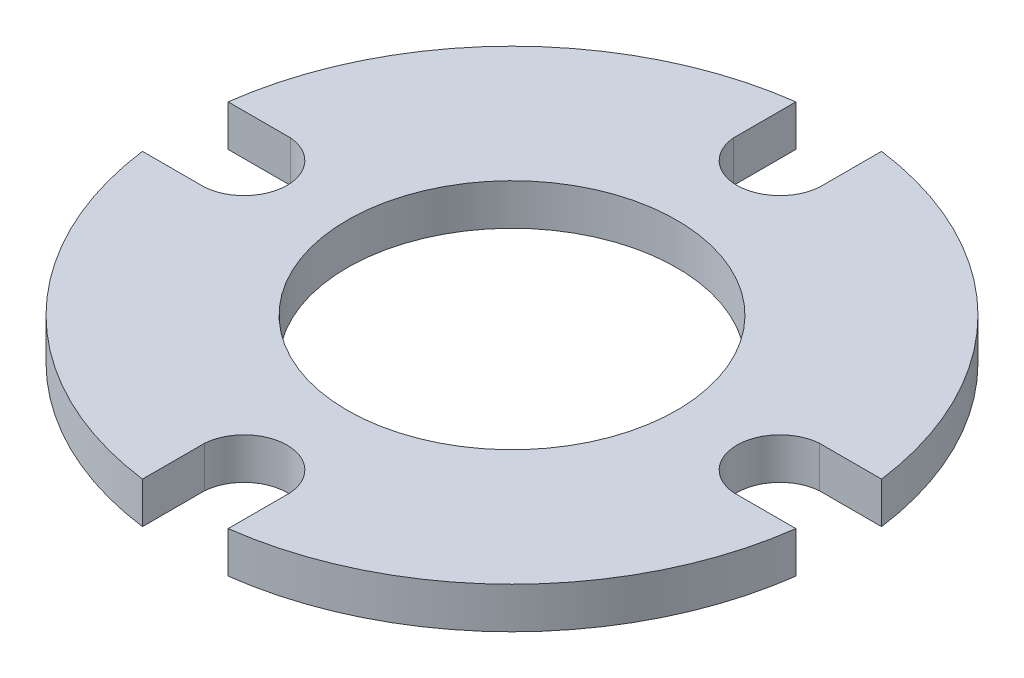
ISO-10303-21;
HEADER;
FILE_DESCRIPTION(('STEP AP214'),'2;1');
FILE_NAME('part.step','',(''),(''),'','','');
FILE_SCHEMA(('AUTOMOTIVE_DESIGN { 1 0 10303 214 1 1 1 1 }'));
ENDSEC;
DATA;
#1=APPLICATION_CONTEXT('core data for automotive mechanical design processes');
#2=APPLICATION_PROTOCOL_DEFINITION('international standard','automotive_design',2000,#1);
#3=PRODUCT_CONTEXT('',#1,'mechanical');
#4=PRODUCT('Part','Part','',(#3));
#5=PRODUCT_RELATED_PRODUCT_CATEGORY('part','',(#4));
#6=PRODUCT_DEFINITION_FORMATION('','',#4);
#7=PRODUCT_DEFINITION_CONTEXT('part definition',#1,'design');
#8=PRODUCT_DEFINITION('design','',#6,#7);
#9=PRODUCT_DEFINITION_SHAPE('','',#8);
#10=(LENGTH_UNIT() NAMED_UNIT(*) SI_UNIT(.MILLI.,.METRE.));
#11=(NAMED_UNIT(*) PLANE_ANGLE_UNIT() SI_UNIT($,.RADIAN.));
#12=(NAMED_UNIT(*) SI_UNIT($,.STERADIAN.) SOLID_ANGLE_UNIT());
#13=UNCERTAINTY_MEASURE_WITH_UNIT(LENGTH_MEASURE(1.E-05),#10,'distance_accuracy_value','');
#14=(GEOMETRIC_REPRESENTATION_CONTEXT(3) GLOBAL_UNCERTAINTY_ASSIGNED_CONTEXT((#13)) GLOBAL_UNIT_ASSIGNED_CONTEXT((#10,
#11,#12)) REPRESENTATION_CONTEXT('',''));
#15=CARTESIAN_POINT('',(0.,0.,0.));
#16=DIRECTION('',(0.,0.,1.));
#17=DIRECTION('',(1.,0.,0.));
#18=AXIS2_PLACEMENT_3D('',#15,#16,#17);
#19=CARTESIAN_POINT('',(0.,0.125,0.));
#20=DIRECTION('',(0.,1.,0.));
#21=DIRECTION('',(0.,0.,1.));
#22=AXIS2_PLACEMENT_3D('',#19,#20,#21);
#23=PLANE('',#22);
#24=CARTESIAN_POINT('',(0.,0.125,0.));
#25=DIRECTION('',(0.,1.,0.));
#26=DIRECTION('',(0.,0.,1.));
#27=AXIS2_PLACEMENT_3D('',#24,#25,#26);
#28=CIRCLE('',#27,1.);
#29=CARTESIAN_POINT('',(-0.13,0.125,-0.99151399384981));
#30=VERTEX_POINT('',#29);
#31=CARTESIAN_POINT('',(-0.991513993849809,0.125,-0.13));
#32=VERTEX_POINT('',#31);
#33=EDGE_CURVE('E213',#30,#32,#28,.T.);
#34=ORIENTED_EDGE('',*,*,#33,.T.);
#35=DIRECTION('',(1.,0.,0.));
#36=VECTOR('',#35,1.);
#37=CARTESIAN_POINT('',(-0.991513993849809,0.125,-0.13));
#38=LINE('',#37,#36);
#39=CARTESIAN_POINT('',(-0.802539095620892,0.125,-0.13));
#40=VERTEX_POINT('',#39);
#41=EDGE_CURVE('E121',#32,#40,#38,.T.);
#42=ORIENTED_EDGE('',*,*,#41,.T.);
#43=CARTESIAN_POINT('',(-0.813,0.125,0.));
#44=DIRECTION('',(0.,-1.,0.));
#45=DIRECTION('',(0.,0.,1.));
#46=AXIS2_PLACEMENT_3D('',#43,#44,#45);
#47=CIRCLE('',#46,0.130420207484994);
#48=CARTESIAN_POINT('',(-0.802539095620892,0.125,0.13));
#49=VERTEX_POINT('',#48);
#50=EDGE_CURVE('E252',#40,#49,#47,.T.);
#51=ORIENTED_EDGE('',*,*,#50,.T.);
#52=DIRECTION('',(-1.,0.,0.));
#53=VECTOR('',#52,1.);
#54=CARTESIAN_POINT('',(-0.991513993849809,0.125,0.13));
#55=LINE('',#54,#53);
#56=CARTESIAN_POINT('',(-0.991513993849809,0.125,0.13));
#57=VERTEX_POINT('',#56);
#58=EDGE_CURVE('E271',#49,#57,#55,.T.);
#59=ORIENTED_EDGE('',*,*,#58,.T.);
#60=CARTESIAN_POINT('',(0.,0.125,0.));
#61=DIRECTION('',(0.,1.,0.));
#62=DIRECTION('',(0.,0.,1.));
#63=AXIS2_PLACEMENT_3D('',#60,#61,#62);
#64=CIRCLE('',#63,1.);
#65=CARTESIAN_POINT('',(-0.13,0.125,0.991513993849809));
#66=VERTEX_POINT('',#65);
#67=EDGE_CURVE('E268',#57,#66,#64,.T.);
#68=ORIENTED_EDGE('',*,*,#67,.T.);
#69=DIRECTION('',(0.,0.,-1.));
#70=VECTOR('',#69,1.);
#71=CARTESIAN_POINT('',(-0.13,0.125,0.991513993849809));
#72=LINE('',#71,#70);
#73=CARTESIAN_POINT('',(-0.13,0.125,0.802539095620892));
#74=VERTEX_POINT('',#73);
#75=EDGE_CURVE('E270',#66,#74,#72,.T.);
#76=ORIENTED_EDGE('',*,*,#75,.T.);
#77=CARTESIAN_POINT('',(0.,0.125,0.813));
#78=DIRECTION('',(0.,-1.,0.));
#79=DIRECTION('',(0.,0.,1.));
#80=AXIS2_PLACEMENT_3D('',#77,#78,#79);
#81=CIRCLE('',#80,0.130420207484994);
#82=CARTESIAN_POINT('',(0.13,0.125,0.802539095620892));
#83=VERTEX_POINT('',#82);
#84=EDGE_CURVE('E273',#74,#83,#81,.T.);
#85=ORIENTED_EDGE('',*,*,#84,.T.);
#86=DIRECTION('',(0.,0.,1.));
#87=VECTOR('',#86,1.);
#88=CARTESIAN_POINT('',(0.13,0.125,0.991513993849809));
#89=LINE('',#88,#87);
#90=CARTESIAN_POINT('',(0.13,0.125,0.991513993849809));
#91=VERTEX_POINT('',#90);
#92=EDGE_CURVE('E279',#83,#91,#89,.T.);
#93=ORIENTED_EDGE('',*,*,#92,.T.);
#94=CARTESIAN_POINT('',(0.,0.125,0.));
#95=DIRECTION('',(0.,1.,0.));
#96=DIRECTION('',(0.,0.,1.));
#97=AXIS2_PLACEMENT_3D('',#94,#95,#96);
#98=CIRCLE('',#97,1.);
#99=CARTESIAN_POINT('',(0.991513993849809,0.125,0.13));
#100=VERTEX_POINT('',#99);
#101=EDGE_CURVE('E281',#91,#100,#98,.T.);
#102=ORIENTED_EDGE('',*,*,#101,.T.);
#103=DIRECTION('',(-1.,0.,0.));
#104=VECTOR('',#103,1.);
#105=CARTESIAN_POINT('',(0.991513993849809,0.125,0.13));
#106=LINE('',#105,#104);
#107=CARTESIAN_POINT('',(0.802539095620892,0.125,0.13));
#108=VERTEX_POINT('',#107);
#109=EDGE_CURVE('E283',#100,#108,#106,.T.);
#110=ORIENTED_EDGE('',*,*,#109,.T.);
#111=CARTESIAN_POINT('',(0.813,0.125,0.));
#112=DIRECTION('',(0.,-1.,0.));
#113=DIRECTION('',(0.,0.,1.));
#114=AXIS2_PLACEMENT_3D('',#111,#112,#113);
#115=CIRCLE('',#114,0.130420207484994);
#116=CARTESIAN_POINT('',(0.802539095620893,0.125,-0.13));
#117=VERTEX_POINT('',#116);
#118=EDGE_CURVE('E285',#108,#117,#115,.T.);
#119=ORIENTED_EDGE('',*,*,#118,.T.);
#120=DIRECTION('',(1.,0.,0.));
#121=VECTOR('',#120,1.);
#122=CARTESIAN_POINT('',(0.991513993849809,0.125,-0.13));
#123=LINE('',#122,#121);
#124=CARTESIAN_POINT('',(0.991513993849809,0.125,-0.13));
#125=VERTEX_POINT('',#124);
#126=EDGE_CURVE('E287',#117,#125,#123,.T.);
#127=ORIENTED_EDGE('',*,*,#126,.T.);
#128=CARTESIAN_POINT('',(0.,0.125,0.));
#129=DIRECTION('',(0.,1.,0.));
#130=DIRECTION('',(0.,0.,1.));
#131=AXIS2_PLACEMENT_3D('',#128,#129,#130);
#132=CIRCLE('',#131,1.);
#133=CARTESIAN_POINT('',(0.13,0.125,-0.99151399384981));
#134=VERTEX_POINT('',#133);
#135=EDGE_CURVE('E164',#125,#134,#132,.T.);
#136=ORIENTED_EDGE('',*,*,#135,.T.);
#137=DIRECTION('',(0.,0.,1.));
#138=VECTOR('',#137,1.);
#139=CARTESIAN_POINT('',(0.13,0.125,-0.99151399384981));
#140=LINE('',#139,#138);
#141=CARTESIAN_POINT('',(0.13,0.125,-0.802539095620893));
#142=VERTEX_POINT('',#141);
#143=EDGE_CURVE('E158',#134,#142,#140,.T.);
#144=ORIENTED_EDGE('',*,*,#143,.T.);
#145=CARTESIAN_POINT('',(0.,0.125,-0.813));
#146=DIRECTION('',(0.,-1.,0.));
#147=DIRECTION('',(0.,0.,1.));
#148=AXIS2_PLACEMENT_3D('',#145,#146,#147);
#149=CIRCLE('',#148,0.130420207484994);
#150=CARTESIAN_POINT('',(-0.13,0.125,-0.802539095620893));
#151=VERTEX_POINT('',#150);
#152=EDGE_CURVE('E162',#142,#151,#149,.T.);
#153=ORIENTED_EDGE('',*,*,#152,.T.);
#154=DIRECTION('',(0.,0.,-1.));
#155=VECTOR('',#154,1.);
#156=CARTESIAN_POINT('',(-0.13,0.125,-0.99151399384981));
#157=LINE('',#156,#155);
#158=EDGE_CURVE('E54',#151,#30,#157,.T.);
#159=ORIENTED_EDGE('',*,*,#158,.T.);
#160=EDGE_LOOP('',(#34,#42,#51,#59,#68,#76,#85,#93,#102,#110,#119,#127,#136,#144,#153,#159));
#161=FACE_BOUND('',#160,.T.);
#162=CARTESIAN_POINT('',(0.,0.125,0.));
#163=DIRECTION('',(0.,1.,0.));
#164=DIRECTION('',(0.,0.,1.));
#165=AXIS2_PLACEMENT_3D('',#162,#163,#164);
#166=CIRCLE('',#165,0.5);
#167=CARTESIAN_POINT('',(0.,0.125,0.5));
#168=VERTEX_POINT('',#167);
#169=EDGE_CURVE('E186',#168,#168,#166,.T.);
#170=ORIENTED_EDGE('',*,*,#169,.F.);
#171=EDGE_LOOP('',(#170));
#172=FACE_BOUND('',#171,.T.);
#173=ADVANCED_FACE('F37',(#161,#172),#23,.T.);
#174=CARTESIAN_POINT('',(0.,0.,0.));
#175=DIRECTION('',(0.,1.,0.));
#176=DIRECTION('',(0.,0.,1.));
#177=AXIS2_PLACEMENT_3D('',#174,#175,#176);
#178=PLANE('',#177);
#179=CARTESIAN_POINT('',(0.,0.,0.));
#180=DIRECTION('',(0.,1.,0.));
#181=DIRECTION('',(0.,0.,1.));
#182=AXIS2_PLACEMENT_3D('',#179,#180,#181);
#183=CIRCLE('',#182,1.);
#184=CARTESIAN_POINT('',(-0.13,0.,-0.99151399384981));
#185=VERTEX_POINT('',#184);
#186=CARTESIAN_POINT('',(-0.991513993849809,0.,-0.13));
#187=VERTEX_POINT('',#186);
#188=EDGE_CURVE('E182',#185,#187,#183,.T.);
#189=ORIENTED_EDGE('',*,*,#188,.F.);
#190=DIRECTION('',(0.,0.,-1.));
#191=VECTOR('',#190,1.);
#192=CARTESIAN_POINT('',(-0.13,0.,-0.99151399384981));
#193=LINE('',#192,#191);
#194=CARTESIAN_POINT('',(-0.13,0.,-0.802539095620893));
#195=VERTEX_POINT('',#194);
#196=EDGE_CURVE('E113',#195,#185,#193,.T.);
#197=ORIENTED_EDGE('',*,*,#196,.F.);
#198=CARTESIAN_POINT('',(0.,0.,-0.813));
#199=DIRECTION('',(0.,-1.,0.));
#200=DIRECTION('',(0.,0.,1.));
#201=AXIS2_PLACEMENT_3D('',#198,#199,#200);
#202=CIRCLE('',#201,0.130420207484994);
#203=CARTESIAN_POINT('',(0.13,0.,-0.802539095620893));
#204=VERTEX_POINT('',#203);
#205=EDGE_CURVE('E107',#204,#195,#202,.T.);
#206=ORIENTED_EDGE('',*,*,#205,.F.);
#207=DIRECTION('',(0.,0.,1.));
#208=VECTOR('',#207,1.);
#209=CARTESIAN_POINT('',(0.13,0.,-0.99151399384981));
#210=LINE('',#209,#208);
#211=CARTESIAN_POINT('',(0.13,0.,-0.99151399384981));
#212=VERTEX_POINT('',#211);
#213=EDGE_CURVE('E172',#212,#204,#210,.T.);
#214=ORIENTED_EDGE('',*,*,#213,.F.);
#215=CARTESIAN_POINT('',(0.,0.,0.));
#216=DIRECTION('',(0.,1.,0.));
#217=DIRECTION('',(0.,0.,1.));
#218=AXIS2_PLACEMENT_3D('',#215,#216,#217);
#219=CIRCLE('',#218,1.);
#220=CARTESIAN_POINT('',(0.991513993849809,0.,-0.13));
#221=VERTEX_POINT('',#220);
#222=EDGE_CURVE('E208',#221,#212,#219,.T.);
#223=ORIENTED_EDGE('',*,*,#222,.F.);
#224=DIRECTION('',(1.,0.,0.));
#225=VECTOR('',#224,1.);
#226=CARTESIAN_POINT('',(0.991513993849809,0.,-0.13));
#227=LINE('',#226,#225);
#228=CARTESIAN_POINT('',(0.802539095620893,0.,-0.13));
#229=VERTEX_POINT('',#228);
#230=EDGE_CURVE('E206',#229,#221,#227,.T.);
#231=ORIENTED_EDGE('',*,*,#230,.F.);
#232=CARTESIAN_POINT('',(0.813,0.,0.));
#233=DIRECTION('',(0.,-1.,0.));
#234=DIRECTION('',(0.,0.,1.));
#235=AXIS2_PLACEMENT_3D('',#232,#233,#234);
#236=CIRCLE('',#235,0.130420207484994);
#237=CARTESIAN_POINT('',(0.802539095620892,0.,0.13));
#238=VERTEX_POINT('',#237);
#239=EDGE_CURVE('E204',#238,#229,#236,.T.);
#240=ORIENTED_EDGE('',*,*,#239,.F.);
#241=DIRECTION('',(-1.,0.,0.));
#242=VECTOR('',#241,1.);
#243=CARTESIAN_POINT('',(0.991513993849809,0.,0.13));
#244=LINE('',#243,#242);
#245=CARTESIAN_POINT('',(0.991513993849809,0.,0.13));
#246=VERTEX_POINT('',#245);
#247=EDGE_CURVE('E202',#246,#238,#244,.T.);
#248=ORIENTED_EDGE('',*,*,#247,.F.);
#249=CARTESIAN_POINT('',(0.,0.,0.));
#250=DIRECTION('',(0.,1.,0.));
#251=DIRECTION('',(0.,0.,1.));
#252=AXIS2_PLACEMENT_3D('',#249,#250,#251);
#253=CIRCLE('',#252,1.);
#254=CARTESIAN_POINT('',(0.13,0.,0.991513993849809));
#255=VERTEX_POINT('',#254);
#256=EDGE_CURVE('E200',#255,#246,#253,.T.);
#257=ORIENTED_EDGE('',*,*,#256,.F.);
#258=DIRECTION('',(0.,0.,1.));
#259=VECTOR('',#258,1.);
#260=CARTESIAN_POINT('',(0.13,0.,0.991513993849809));
#261=LINE('',#260,#259);
#262=CARTESIAN_POINT('',(0.13,0.,0.802539095620892));
#263=VERTEX_POINT('',#262);
#264=EDGE_CURVE('E198',#263,#255,#261,.T.);
#265=ORIENTED_EDGE('',*,*,#264,.F.);
#266=CARTESIAN_POINT('',(0.,0.,0.813));
#267=DIRECTION('',(0.,-1.,0.));
#268=DIRECTION('',(0.,0.,1.));
#269=AXIS2_PLACEMENT_3D('',#266,#267,#268);
#270=CIRCLE('',#269,0.130420207484994);
#271=CARTESIAN_POINT('',(-0.13,0.,0.802539095620892));
#272=VERTEX_POINT('',#271);
#273=EDGE_CURVE('E196',#272,#263,#270,.T.);
#274=ORIENTED_EDGE('',*,*,#273,.F.);
#275=DIRECTION('',(0.,0.,-1.));
#276=VECTOR('',#275,1.);
#277=CARTESIAN_POINT('',(-0.13,0.,0.991513993849809));
#278=LINE('',#277,#276);
#279=CARTESIAN_POINT('',(-0.13,0.,0.991513993849809));
#280=VERTEX_POINT('',#279);
#281=EDGE_CURVE('E194',#280,#272,#278,.T.);
#282=ORIENTED_EDGE('',*,*,#281,.F.);
#283=CARTESIAN_POINT('',(0.,0.,0.));
#284=DIRECTION('',(0.,1.,0.));
#285=DIRECTION('',(0.,0.,1.));
#286=AXIS2_PLACEMENT_3D('',#283,#284,#285);
#287=CIRCLE('',#286,1.);
#288=CARTESIAN_POINT('',(-0.991513993849809,0.,0.13));
#289=VERTEX_POINT('',#288);
#290=EDGE_CURVE('E192',#289,#280,#287,.T.);
#291=ORIENTED_EDGE('',*,*,#290,.F.);
#292=DIRECTION('',(-1.,0.,0.));
#293=VECTOR('',#292,1.);
#294=CARTESIAN_POINT('',(-0.991513993849809,0.,0.13));
#295=LINE('',#294,#293);
#296=CARTESIAN_POINT('',(-0.802539095620892,0.,0.13));
#297=VERTEX_POINT('',#296);
#298=EDGE_CURVE('E190',#297,#289,#295,.T.);
#299=ORIENTED_EDGE('',*,*,#298,.F.);
#300=CARTESIAN_POINT('',(-0.813,0.,0.));
#301=DIRECTION('',(0.,-1.,0.));
#302=DIRECTION('',(0.,0.,1.));
#303=AXIS2_PLACEMENT_3D('',#300,#301,#302);
#304=CIRCLE('',#303,0.130420207484994);
#305=CARTESIAN_POINT('',(-0.802539095620892,0.,-0.13));
#306=VERTEX_POINT('',#305);
#307=EDGE_CURVE('E188',#306,#297,#304,.T.);
#308=ORIENTED_EDGE('',*,*,#307,.F.);
#309=DIRECTION('',(1.,0.,0.));
#310=VECTOR('',#309,1.);
#311=CARTESIAN_POINT('',(-0.991513993849809,0.,-0.13));
#312=LINE('',#311,#310);
#313=EDGE_CURVE('E185',#187,#306,#312,.T.);
#314=ORIENTED_EDGE('',*,*,#313,.F.);
#315=EDGE_LOOP('',(#189,#197,#206,#214,#223,#231,#240,#248,#257,#265,#274,#282,#291,#299,#308,#314));
#316=FACE_BOUND('',#315,.T.);
#317=CARTESIAN_POINT('',(0.,0.,0.));
#318=DIRECTION('',(0.,1.,0.));
#319=DIRECTION('',(0.,0.,1.));
#320=AXIS2_PLACEMENT_3D('',#317,#318,#319);
#321=CIRCLE('',#320,0.5);
#322=CARTESIAN_POINT('',(0.,0.,0.5));
#323=VERTEX_POINT('',#322);
#324=EDGE_CURVE('E524',#323,#323,#321,.T.);
#325=ORIENTED_EDGE('',*,*,#324,.T.);
#326=EDGE_LOOP('',(#325));
#327=FACE_BOUND('',#326,.T.);
#328=ADVANCED_FACE('F256',(#316,#327),#178,.F.);
#329=CARTESIAN_POINT('',(0.,0.125,0.));
#330=DIRECTION('',(0.,-1.,0.));
#331=DIRECTION('',(0.,0.,-1.));
#332=AXIS2_PLACEMENT_3D('',#329,#330,#331);
#333=CYLINDRICAL_SURFACE('',#332,1.);
#334=ORIENTED_EDGE('',*,*,#188,.T.);
#335=DIRECTION('',(0.,-1.,0.));
#336=VECTOR('',#335,1.);
#337=CARTESIAN_POINT('',(-0.991513993849809,0.125,-0.13));
#338=LINE('',#337,#336);
#339=EDGE_CURVE('E11',#32,#187,#338,.T.);
#340=ORIENTED_EDGE('',*,*,#339,.F.);
#341=ORIENTED_EDGE('',*,*,#33,.F.);
#342=DIRECTION('',(0.,-1.,0.));
#343=VECTOR('',#342,1.);
#344=CARTESIAN_POINT('',(-0.13,0.125,-0.99151399384981));
#345=LINE('',#344,#343);
#346=EDGE_CURVE('E178',#30,#185,#345,.T.);
#347=ORIENTED_EDGE('',*,*,#346,.T.);
#348=EDGE_LOOP('',(#334,#340,#341,#347));
#349=FACE_BOUND('',#348,.T.);
#350=ADVANCED_FACE('F39',(#349),#333,.T.);
#351=CARTESIAN_POINT('',(-0.991513993849809,0.125,-0.13));
#352=DIRECTION('',(0.,0.,-1.));
#353=DIRECTION('',(-1.,0.,0.));
#354=AXIS2_PLACEMENT_3D('',#351,#352,#353);
#355=PLANE('',#354);
#356=ORIENTED_EDGE('',*,*,#313,.T.);
#357=DIRECTION('',(0.,-1.,0.));
#358=VECTOR('',#357,1.);
#359=CARTESIAN_POINT('',(-0.802539095620892,0.125,-0.13));
#360=LINE('',#359,#358);
#361=EDGE_CURVE('E46',#40,#306,#360,.T.);
#362=ORIENTED_EDGE('',*,*,#361,.F.);
#363=ORIENTED_EDGE('',*,*,#41,.F.);
#364=ORIENTED_EDGE('',*,*,#339,.T.);
#365=EDGE_LOOP('',(#356,#362,#363,#364));
#366=FACE_BOUND('',#365,.T.);
#367=ADVANCED_FACE('F321',(#366),#355,.F.);
#368=CARTESIAN_POINT('',(-0.813,0.125,0.));
#369=DIRECTION('',(0.,-1.,0.));
#370=DIRECTION('',(0.,0.,-1.));
#371=AXIS2_PLACEMENT_3D('',#368,#369,#370);
#372=CYLINDRICAL_SURFACE('',#371,0.130420207484994);
#373=ORIENTED_EDGE('',*,*,#307,.T.);
#374=DIRECTION('',(0.,-1.,0.));
#375=VECTOR('',#374,1.);
#376=CARTESIAN_POINT('',(-0.802539095620892,0.125,0.13));
#377=LINE('',#376,#375);
#378=EDGE_CURVE('E244',#49,#297,#377,.T.);
#379=ORIENTED_EDGE('',*,*,#378,.F.);
#380=ORIENTED_EDGE('',*,*,#50,.F.);
#381=ORIENTED_EDGE('',*,*,#361,.T.);
#382=EDGE_LOOP('',(#373,#379,#380,#381));
#383=FACE_BOUND('',#382,.T.);
#384=ADVANCED_FACE('F250',(#383),#372,.F.);
#385=CARTESIAN_POINT('',(-0.991513993849809,0.125,0.13));
#386=DIRECTION('',(0.,0.,1.));
#387=DIRECTION('',(1.,0.,0.));
#388=AXIS2_PLACEMENT_3D('',#385,#386,#387);
#389=PLANE('',#388);
#390=ORIENTED_EDGE('',*,*,#298,.T.);
#391=DIRECTION('',(0.,-1.,0.));
#392=VECTOR('',#391,1.);
#393=CARTESIAN_POINT('',(-0.991513993849809,0.125,0.13));
#394=LINE('',#393,#392);
#395=EDGE_CURVE('E241',#57,#289,#394,.T.);
#396=ORIENTED_EDGE('',*,*,#395,.F.);
#397=ORIENTED_EDGE('',*,*,#58,.F.);
#398=ORIENTED_EDGE('',*,*,#378,.T.);
#399=EDGE_LOOP('',(#390,#396,#397,#398));
#400=FACE_BOUND('',#399,.T.);
#401=ADVANCED_FACE('F262',(#400),#389,.F.);
#402=CARTESIAN_POINT('',(0.,0.125,0.));
#403=DIRECTION('',(0.,-1.,0.));
#404=DIRECTION('',(0.,0.,-1.));
#405=AXIS2_PLACEMENT_3D('',#402,#403,#404);
#406=CYLINDRICAL_SURFACE('',#405,1.);
#407=ORIENTED_EDGE('',*,*,#290,.T.);
#408=DIRECTION('',(0.,-1.,0.));
#409=VECTOR('',#408,1.);
#410=CARTESIAN_POINT('',(-0.13,0.125,0.991513993849809));
#411=LINE('',#410,#409);
#412=EDGE_CURVE('E238',#66,#280,#411,.T.);
#413=ORIENTED_EDGE('',*,*,#412,.F.);
#414=ORIENTED_EDGE('',*,*,#67,.F.);
#415=ORIENTED_EDGE('',*,*,#395,.T.);
#416=EDGE_LOOP('',(#407,#413,#414,#415));
#417=FACE_BOUND('',#416,.T.);
#418=ADVANCED_FACE('F266',(#417),#406,.T.);
#419=CARTESIAN_POINT('',(-0.13,0.125,0.991513993849809));
#420=DIRECTION('',(-1.,0.,0.));
#421=DIRECTION('',(0.,0.,1.));
#422=AXIS2_PLACEMENT_3D('',#419,#420,#421);
#423=PLANE('',#422);
#424=ORIENTED_EDGE('',*,*,#281,.T.);
#425=DIRECTION('',(0.,-1.,0.));
#426=VECTOR('',#425,1.);
#427=CARTESIAN_POINT('',(-0.13,0.125,0.802539095620892));
#428=LINE('',#427,#426);
#429=EDGE_CURVE('E235',#74,#272,#428,.T.);
#430=ORIENTED_EDGE('',*,*,#429,.F.);
#431=ORIENTED_EDGE('',*,*,#75,.F.);
#432=ORIENTED_EDGE('',*,*,#412,.T.);
#433=EDGE_LOOP('',(#424,#430,#431,#432));
#434=FACE_BOUND('',#433,.T.);
#435=ADVANCED_FACE('F334',(#434),#423,.F.);
#436=CARTESIAN_POINT('',(0.,0.125,0.813));
#437=DIRECTION('',(0.,-1.,0.));
#438=DIRECTION('',(0.,0.,-1.));
#439=AXIS2_PLACEMENT_3D('',#436,#437,#438);
#440=CYLINDRICAL_SURFACE('',#439,0.130420207484994);
#441=ORIENTED_EDGE('',*,*,#273,.T.);
#442=DIRECTION('',(0.,-1.,0.));
#443=VECTOR('',#442,1.);
#444=CARTESIAN_POINT('',(0.13,0.125,0.802539095620892));
#445=LINE('',#444,#443);
#446=EDGE_CURVE('E232',#83,#263,#445,.T.);
#447=ORIENTED_EDGE('',*,*,#446,.F.);
#448=ORIENTED_EDGE('',*,*,#84,.F.);
#449=ORIENTED_EDGE('',*,*,#429,.T.);
#450=EDGE_LOOP('',(#441,#447,#448,#449));
#451=FACE_BOUND('',#450,.T.);
#452=ADVANCED_FACE('F337',(#451),#440,.F.);
#453=CARTESIAN_POINT('',(0.13,0.125,0.991513993849809));
#454=DIRECTION('',(1.,0.,0.));
#455=DIRECTION('',(0.,0.,-1.));
#456=AXIS2_PLACEMENT_3D('',#453,#454,#455);
#457=PLANE('',#456);
#458=ORIENTED_EDGE('',*,*,#264,.T.);
#459=DIRECTION('',(0.,-1.,0.));
#460=VECTOR('',#459,1.);
#461=CARTESIAN_POINT('',(0.13,0.125,0.991513993849809));
#462=LINE('',#461,#460);
#463=EDGE_CURVE('E229',#91,#255,#462,.T.);
#464=ORIENTED_EDGE('',*,*,#463,.F.);
#465=ORIENTED_EDGE('',*,*,#92,.F.);
#466=ORIENTED_EDGE('',*,*,#446,.T.);
#467=EDGE_LOOP('',(#458,#464,#465,#466));
#468=FACE_BOUND('',#467,.T.);
#469=ADVANCED_FACE('F341',(#468),#457,.F.);
#470=CARTESIAN_POINT('',(0.,0.125,0.));
#471=DIRECTION('',(0.,-1.,0.));
#472=DIRECTION('',(0.,0.,-1.));
#473=AXIS2_PLACEMENT_3D('',#470,#471,#472);
#474=CYLINDRICAL_SURFACE('',#473,1.);
#475=ORIENTED_EDGE('',*,*,#256,.T.);
#476=DIRECTION('',(0.,-1.,0.));
#477=VECTOR('',#476,1.);
#478=CARTESIAN_POINT('',(0.991513993849809,0.125,0.13));
#479=LINE('',#478,#477);
#480=EDGE_CURVE('E226',#100,#246,#479,.T.);
#481=ORIENTED_EDGE('',*,*,#480,.F.);
#482=ORIENTED_EDGE('',*,*,#101,.F.);
#483=ORIENTED_EDGE('',*,*,#463,.T.);
#484=EDGE_LOOP('',(#475,#481,#482,#483));
#485=FACE_BOUND('',#484,.T.);
#486=ADVANCED_FACE('F345',(#485),#474,.T.);
#487=CARTESIAN_POINT('',(0.991513993849809,0.125,0.13));
#488=DIRECTION('',(0.,0.,1.));
#489=DIRECTION('',(1.,0.,0.));
#490=AXIS2_PLACEMENT_3D('',#487,#488,#489);
#491=PLANE('',#490);
#492=ORIENTED_EDGE('',*,*,#247,.T.);
#493=DIRECTION('',(0.,-1.,0.));
#494=VECTOR('',#493,1.);
#495=CARTESIAN_POINT('',(0.802539095620892,0.125,0.13));
#496=LINE('',#495,#494);
#497=EDGE_CURVE('E223',#108,#238,#496,.T.);
#498=ORIENTED_EDGE('',*,*,#497,.F.);
#499=ORIENTED_EDGE('',*,*,#109,.F.);
#500=ORIENTED_EDGE('',*,*,#480,.T.);
#501=EDGE_LOOP('',(#492,#498,#499,#500));
#502=FACE_BOUND('',#501,.T.);
#503=ADVANCED_FACE('F349',(#502),#491,.F.);
#504=CARTESIAN_POINT('',(0.813,0.125,0.));
#505=DIRECTION('',(0.,-1.,0.));
#506=DIRECTION('',(0.,0.,-1.));
#507=AXIS2_PLACEMENT_3D('',#504,#505,#506);
#508=CYLINDRICAL_SURFACE('',#507,0.130420207484994);
#509=ORIENTED_EDGE('',*,*,#239,.T.);
#510=DIRECTION('',(0.,-1.,0.));
#511=VECTOR('',#510,1.);
#512=CARTESIAN_POINT('',(0.802539095620893,0.125,-0.13));
#513=LINE('',#512,#511);
#514=EDGE_CURVE('E220',#117,#229,#513,.T.);
#515=ORIENTED_EDGE('',*,*,#514,.F.);
#516=ORIENTED_EDGE('',*,*,#118,.F.);
#517=ORIENTED_EDGE('',*,*,#497,.T.);
#518=EDGE_LOOP('',(#509,#515,#516,#517));
#519=FACE_BOUND('',#518,.T.);
#520=ADVANCED_FACE('F353',(#519),#508,.F.);
#521=CARTESIAN_POINT('',(0.991513993849809,0.125,-0.13));
#522=DIRECTION('',(0.,0.,-1.));
#523=DIRECTION('',(-1.,0.,0.));
#524=AXIS2_PLACEMENT_3D('',#521,#522,#523);
#525=PLANE('',#524);
#526=ORIENTED_EDGE('',*,*,#230,.T.);
#527=DIRECTION('',(0.,-1.,0.));
#528=VECTOR('',#527,1.);
#529=CARTESIAN_POINT('',(0.991513993849809,0.125,-0.13));
#530=LINE('',#529,#528);
#531=EDGE_CURVE('E217',#125,#221,#530,.T.);
#532=ORIENTED_EDGE('',*,*,#531,.F.);
#533=ORIENTED_EDGE('',*,*,#126,.F.);
#534=ORIENTED_EDGE('',*,*,#514,.T.);
#535=EDGE_LOOP('',(#526,#532,#533,#534));
#536=FACE_BOUND('',#535,.T.);
#537=ADVANCED_FACE('F293',(#536),#525,.F.);
#538=CARTESIAN_POINT('',(0.,0.125,0.));
#539=DIRECTION('',(0.,-1.,0.));
#540=DIRECTION('',(0.,0.,-1.));
#541=AXIS2_PLACEMENT_3D('',#538,#539,#540);
#542=CYLINDRICAL_SURFACE('',#541,1.);
#543=ORIENTED_EDGE('',*,*,#222,.T.);
#544=DIRECTION('',(0.,-1.,0.));
#545=VECTOR('',#544,1.);
#546=CARTESIAN_POINT('',(0.13,0.125,-0.99151399384981));
#547=LINE('',#546,#545);
#548=EDGE_CURVE('E173',#134,#212,#547,.T.);
#549=ORIENTED_EDGE('',*,*,#548,.F.);
#550=ORIENTED_EDGE('',*,*,#135,.F.);
#551=ORIENTED_EDGE('',*,*,#531,.T.);
#552=EDGE_LOOP('',(#543,#549,#550,#551));
#553=FACE_BOUND('',#552,.T.);
#554=ADVANCED_FACE('F297',(#553),#542,.T.);
#555=CARTESIAN_POINT('',(0.13,0.125,-0.99151399384981));
#556=DIRECTION('',(1.,0.,0.));
#557=DIRECTION('',(0.,0.,-1.));
#558=AXIS2_PLACEMENT_3D('',#555,#556,#557);
#559=PLANE('',#558);
#560=ORIENTED_EDGE('',*,*,#213,.T.);
#561=DIRECTION('',(0.,-1.,0.));
#562=VECTOR('',#561,1.);
#563=CARTESIAN_POINT('',(0.13,0.125,-0.802539095620893));
#564=LINE('',#563,#562);
#565=EDGE_CURVE('E169',#142,#204,#564,.T.);
#566=ORIENTED_EDGE('',*,*,#565,.F.);
#567=ORIENTED_EDGE('',*,*,#143,.F.);
#568=ORIENTED_EDGE('',*,*,#548,.T.);
#569=EDGE_LOOP('',(#560,#566,#567,#568));
#570=FACE_BOUND('',#569,.T.);
#571=ADVANCED_FACE('F170',(#570),#559,.F.);
#572=CARTESIAN_POINT('',(0.,0.125,-0.813));
#573=DIRECTION('',(0.,-1.,0.));
#574=DIRECTION('',(0.,0.,-1.));
#575=AXIS2_PLACEMENT_3D('',#572,#573,#574);
#576=CYLINDRICAL_SURFACE('',#575,0.130420207484994);
#577=ORIENTED_EDGE('',*,*,#205,.T.);
#578=DIRECTION('',(0.,-1.,0.));
#579=VECTOR('',#578,1.);
#580=CARTESIAN_POINT('',(-0.13,0.125,-0.802539095620893));
#581=LINE('',#580,#579);
#582=EDGE_CURVE('E174',#151,#195,#581,.T.);
#583=ORIENTED_EDGE('',*,*,#582,.F.);
#584=ORIENTED_EDGE('',*,*,#152,.F.);
#585=ORIENTED_EDGE('',*,*,#565,.T.);
#586=EDGE_LOOP('',(#577,#583,#584,#585));
#587=FACE_BOUND('',#586,.T.);
#588=ADVANCED_FACE('F176',(#587),#576,.F.);
#589=CARTESIAN_POINT('',(-0.13,0.125,-0.99151399384981));
#590=DIRECTION('',(-1.,0.,0.));
#591=DIRECTION('',(0.,0.,1.));
#592=AXIS2_PLACEMENT_3D('',#589,#590,#591);
#593=PLANE('',#592);
#594=ORIENTED_EDGE('',*,*,#196,.T.);
#595=ORIENTED_EDGE('',*,*,#346,.F.);
#596=ORIENTED_EDGE('',*,*,#158,.F.);
#597=ORIENTED_EDGE('',*,*,#582,.T.);
#598=EDGE_LOOP('',(#594,#595,#596,#597));
#599=FACE_BOUND('',#598,.T.);
#600=ADVANCED_FACE('F301',(#599),#593,.F.);
#601=CARTESIAN_POINT('',(0.,0.125,0.));
#602=DIRECTION('',(0.,-1.,0.));
#603=DIRECTION('',(0.,0.,-1.));
#604=AXIS2_PLACEMENT_3D('',#601,#602,#603);
#605=CYLINDRICAL_SURFACE('',#604,0.5);
#606=ORIENTED_EDGE('',*,*,#169,.T.);
#607=EDGE_LOOP('',(#606));
#608=FACE_BOUND('',#607,.T.);
#609=ORIENTED_EDGE('',*,*,#324,.F.);
#610=EDGE_LOOP('',(#609));
#611=FACE_BOUND('',#610,.T.);
#612=ADVANCED_FACE('F303',(#608,#611),#605,.F.);
#613=CLOSED_SHELL('',(#173,#328,#350,#367,#384,#401,#418,#435,#452,#469,#486,#503,#520,#537,
#554,#571,#588,#600,#612));
#614=MANIFOLD_SOLID_BREP('B2',#613);
#615=ADVANCED_BREP_SHAPE_REPRESENTATION('',(#18,#614),#14);
#616=SHAPE_DEFINITION_REPRESENTATION(#9,#615);
ENDSEC;
END-ISO-10303-21;
